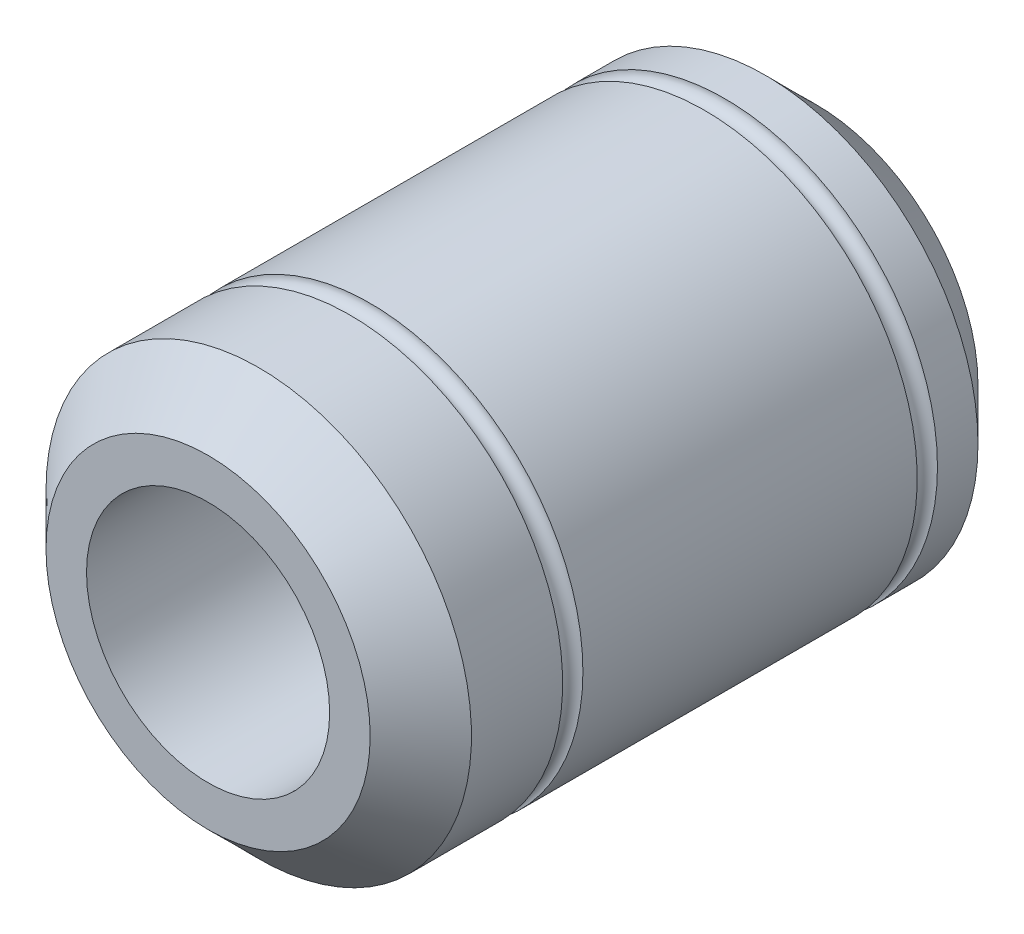
ISO-10303-21;
HEADER;
FILE_DESCRIPTION(('STEP AP214'),'2;1');
FILE_NAME('part.step','',(''),(''),'','','');
FILE_SCHEMA(('AUTOMOTIVE_DESIGN { 1 0 10303 214 1 1 1 1 }'));
ENDSEC;
DATA;
#1=APPLICATION_CONTEXT('core data for automotive mechanical design processes');
#2=APPLICATION_PROTOCOL_DEFINITION('international standard','automotive_design',2000,#1);
#3=PRODUCT_CONTEXT('',#1,'mechanical');
#4=PRODUCT('Part','Part','',(#3));
#5=PRODUCT_RELATED_PRODUCT_CATEGORY('part','',(#4));
#6=PRODUCT_DEFINITION_FORMATION('','',#4);
#7=PRODUCT_DEFINITION_CONTEXT('part definition',#1,'design');
#8=PRODUCT_DEFINITION('design','',#6,#7);
#9=PRODUCT_DEFINITION_SHAPE('','',#8);
#10=(LENGTH_UNIT() NAMED_UNIT(*) SI_UNIT(.MILLI.,.METRE.));
#11=(NAMED_UNIT(*) PLANE_ANGLE_UNIT() SI_UNIT($,.RADIAN.));
#12=(NAMED_UNIT(*) SI_UNIT($,.STERADIAN.) SOLID_ANGLE_UNIT());
#13=UNCERTAINTY_MEASURE_WITH_UNIT(LENGTH_MEASURE(1.E-05),#10,'distance_accuracy_value','');
#14=(GEOMETRIC_REPRESENTATION_CONTEXT(3) GLOBAL_UNCERTAINTY_ASSIGNED_CONTEXT((#13)) GLOBAL_UNIT_ASSIGNED_CONTEXT((#10,
#11,#12)) REPRESENTATION_CONTEXT('',''));
#15=CARTESIAN_POINT('',(0.,0.,0.));
#16=DIRECTION('',(0.,0.,1.));
#17=DIRECTION('',(1.,0.,0.));
#18=AXIS2_PLACEMENT_3D('',#15,#16,#17);
#19=CARTESIAN_POINT('',(0.,0.,-30.));
#20=DIRECTION('',(0.,0.,1.));
#21=DIRECTION('',(1.,0.,0.));
#22=AXIS2_PLACEMENT_3D('',#19,#20,#21);
#23=CYLINDRICAL_SURFACE('',#22,10.5);
#24=CARTESIAN_POINT('',(0.,0.,-27.5));
#25=DIRECTION('',(0.,0.,1.));
#26=DIRECTION('',(1.,0.,0.));
#27=AXIS2_PLACEMENT_3D('',#24,#25,#26);
#28=CIRCLE('',#27,10.5);
#29=CARTESIAN_POINT('',(10.5,0.,-27.5));
#30=VERTEX_POINT('',#29);
#31=EDGE_CURVE('E57',#30,#30,#28,.T.);
#32=ORIENTED_EDGE('',*,*,#31,.T.);
#33=EDGE_LOOP('',(#32));
#34=FACE_BOUND('',#33,.T.);
#35=CARTESIAN_POINT('',(0.,0.,-25.5));
#36=DIRECTION('',(0.,0.,1.));
#37=DIRECTION('',(1.,0.,0.));
#38=AXIS2_PLACEMENT_3D('',#35,#36,#37);
#39=CIRCLE('',#38,10.5);
#40=CARTESIAN_POINT('',(10.5,0.,-25.5));
#41=VERTEX_POINT('',#40);
#42=EDGE_CURVE('E48',#41,#41,#39,.F.);
#43=ORIENTED_EDGE('',*,*,#42,.T.);
#44=EDGE_LOOP('',(#43));
#45=FACE_BOUND('',#44,.T.);
#46=ADVANCED_FACE('F45',(#34,#45),#23,.T.);
#47=CARTESIAN_POINT('',(0.,0.,-2.5));
#48=DIRECTION('',(0.,0.,-1.));
#49=DIRECTION('',(-1.,0.,0.));
#50=AXIS2_PLACEMENT_3D('',#47,#48,#49);
#51=CIRCLE('',#50,10.5);
#52=CARTESIAN_POINT('',(-10.5,0.,-2.5));
#53=VERTEX_POINT('',#52);
#54=EDGE_CURVE('E65',#53,#53,#51,.T.);
#55=ORIENTED_EDGE('',*,*,#54,.T.);
#56=EDGE_LOOP('',(#55));
#57=FACE_BOUND('',#56,.T.);
#58=CARTESIAN_POINT('',(0.,0.,-7.));
#59=DIRECTION('',(0.,0.,-1.));
#60=DIRECTION('',(-1.,0.,0.));
#61=AXIS2_PLACEMENT_3D('',#58,#59,#60);
#62=CIRCLE('',#61,10.5);
#63=CARTESIAN_POINT('',(-10.5,0.,-7.));
#64=VERTEX_POINT('',#63);
#65=EDGE_CURVE('E69',#64,#64,#62,.F.);
#66=ORIENTED_EDGE('',*,*,#65,.T.);
#67=EDGE_LOOP('',(#66));
#68=FACE_BOUND('',#67,.T.);
#69=ADVANCED_FACE('F92',(#57,#68),#23,.T.);
#70=CARTESIAN_POINT('',(0.,0.,-30.));
#71=DIRECTION('',(0.,0.,1.));
#72=DIRECTION('',(1.,0.,0.));
#73=AXIS2_PLACEMENT_3D('',#70,#71,#72);
#74=PLANE('',#73);
#75=CARTESIAN_POINT('',(0.,0.,-30.));
#76=DIRECTION('',(0.,0.,1.));
#77=DIRECTION('',(1.,0.,0.));
#78=AXIS2_PLACEMENT_3D('',#75,#76,#77);
#79=CIRCLE('',#78,6.);
#80=CARTESIAN_POINT('',(6.,0.,-30.));
#81=VERTEX_POINT('',#80);
#82=EDGE_CURVE('E13',#81,#81,#79,.T.);
#83=ORIENTED_EDGE('',*,*,#82,.T.);
#84=EDGE_LOOP('',(#83));
#85=FACE_BOUND('',#84,.T.);
#86=CARTESIAN_POINT('',(0.,0.,-30.));
#87=DIRECTION('',(0.,0.,1.));
#88=DIRECTION('',(1.,0.,0.));
#89=AXIS2_PLACEMENT_3D('',#86,#87,#88);
#90=CIRCLE('',#89,7.99999999999996);
#91=CARTESIAN_POINT('',(7.99999999999996,0.,-30.));
#92=VERTEX_POINT('',#91);
#93=EDGE_CURVE('E66',#92,#92,#90,.T.);
#94=ORIENTED_EDGE('',*,*,#93,.F.);
#95=EDGE_LOOP('',(#94));
#96=FACE_BOUND('',#95,.T.);
#97=ADVANCED_FACE('F99',(#85,#96),#74,.F.);
#98=CARTESIAN_POINT('',(0.,0.,0.));
#99=DIRECTION('',(0.,0.,1.));
#100=DIRECTION('',(1.,0.,0.));
#101=AXIS2_PLACEMENT_3D('',#98,#99,#100);
#102=PLANE('',#101);
#103=CARTESIAN_POINT('',(0.,0.,0.));
#104=DIRECTION('',(0.,0.,1.));
#105=DIRECTION('',(1.,0.,0.));
#106=AXIS2_PLACEMENT_3D('',#103,#104,#105);
#107=CIRCLE('',#106,6.);
#108=CARTESIAN_POINT('',(6.,0.,0.));
#109=VERTEX_POINT('',#108);
#110=EDGE_CURVE('E52',#109,#109,#107,.T.);
#111=ORIENTED_EDGE('',*,*,#110,.F.);
#112=EDGE_LOOP('',(#111));
#113=FACE_BOUND('',#112,.T.);
#114=CARTESIAN_POINT('',(0.,0.,0.));
#115=DIRECTION('',(0.,0.,1.));
#116=DIRECTION('',(1.,0.,0.));
#117=AXIS2_PLACEMENT_3D('',#114,#115,#116);
#118=CIRCLE('',#117,7.99999999999997);
#119=CARTESIAN_POINT('',(7.99999999999997,0.,0.));
#120=VERTEX_POINT('',#119);
#121=EDGE_CURVE('E62',#120,#120,#118,.T.);
#122=ORIENTED_EDGE('',*,*,#121,.T.);
#123=EDGE_LOOP('',(#122));
#124=FACE_BOUND('',#123,.T.);
#125=ADVANCED_FACE('F112',(#113,#124),#102,.T.);
#126=CARTESIAN_POINT('',(0.,0.,-30.));
#127=DIRECTION('',(0.,0.,1.));
#128=DIRECTION('',(1.,0.,0.));
#129=AXIS2_PLACEMENT_3D('',#126,#127,#128);
#130=CYLINDRICAL_SURFACE('',#129,6.);
#131=ORIENTED_EDGE('',*,*,#82,.F.);
#132=EDGE_LOOP('',(#131));
#133=FACE_BOUND('',#132,.T.);
#134=ORIENTED_EDGE('',*,*,#110,.T.);
#135=EDGE_LOOP('',(#134));
#136=FACE_BOUND('',#135,.T.);
#137=ADVANCED_FACE('F117',(#133,#136),#130,.F.);
#138=CARTESIAN_POINT('',(0.,0.,-3.));
#139=DIRECTION('',(0.,0.,-1.));
#140=DIRECTION('',(-1.,0.,0.));
#141=AXIS2_PLACEMENT_3D('',#138,#139,#140);
#142=CONICAL_SURFACE('',#141,11.,0.785398163397453);
#143=ORIENTED_EDGE('',*,*,#54,.F.);
#144=EDGE_LOOP('',(#143));
#145=FACE_BOUND('',#144,.T.);
#146=ORIENTED_EDGE('',*,*,#121,.F.);
#147=EDGE_LOOP('',(#146));
#148=FACE_BOUND('',#147,.T.);
#149=ADVANCED_FACE('F107',(#145,#148),#142,.T.);
#150=CARTESIAN_POINT('',(0.,0.,-30.5));
#151=DIRECTION('',(0.,0.,1.));
#152=DIRECTION('',(1.,0.,0.));
#153=AXIS2_PLACEMENT_3D('',#150,#151,#152);
#154=CONICAL_SURFACE('',#153,7.49999999999995,0.785398163397454);
#155=ORIENTED_EDGE('',*,*,#31,.F.);
#156=EDGE_LOOP('',(#155));
#157=FACE_BOUND('',#156,.T.);
#158=ORIENTED_EDGE('',*,*,#93,.T.);
#159=EDGE_LOOP('',(#158));
#160=FACE_BOUND('',#159,.T.);
#161=ADVANCED_FACE('F104',(#157,#160),#154,.T.);
#162=CARTESIAN_POINT('',(0.,0.,-7.5));
#163=DIRECTION('',(0.,0.,-1.));
#164=DIRECTION('',(-1.,0.,0.));
#165=AXIS2_PLACEMENT_3D('',#162,#163,#164);
#166=TOROIDAL_SURFACE('',#165,10.5,0.500000000000001);
#167=CARTESIAN_POINT('',(0.,0.,-8.));
#168=DIRECTION('',(0.,0.,1.));
#169=DIRECTION('',(1.,0.,0.));
#170=AXIS2_PLACEMENT_3D('',#167,#168,#169);
#171=CIRCLE('',#170,10.5);
#172=CARTESIAN_POINT('',(10.5,0.,-8.));
#173=VERTEX_POINT('',#172);
#174=EDGE_CURVE('E72',#173,#173,#171,.F.);
#175=ORIENTED_EDGE('',*,*,#174,.F.);
#176=EDGE_LOOP('',(#175));
#177=FACE_BOUND('',#176,.T.);
#178=ORIENTED_EDGE('',*,*,#65,.F.);
#179=EDGE_LOOP('',(#178));
#180=FACE_BOUND('',#179,.T.);
#181=ADVANCED_FACE('F90',(#177,#180),#166,.F.);
#182=ORIENTED_EDGE('',*,*,#174,.T.);
#183=EDGE_LOOP('',(#182));
#184=FACE_BOUND('',#183,.T.);
#185=CARTESIAN_POINT('',(0.,0.,-24.5));
#186=DIRECTION('',(0.,0.,-1.));
#187=DIRECTION('',(-1.,0.,0.));
#188=AXIS2_PLACEMENT_3D('',#185,#186,#187);
#189=CIRCLE('',#188,10.5);
#190=CARTESIAN_POINT('',(-10.5,0.,-24.5));
#191=VERTEX_POINT('',#190);
#192=EDGE_CURVE('E74',#191,#191,#189,.F.);
#193=ORIENTED_EDGE('',*,*,#192,.T.);
#194=EDGE_LOOP('',(#193));
#195=FACE_BOUND('',#194,.T.);
#196=ADVANCED_FACE('F85',(#184,#195),#23,.T.);
#197=CARTESIAN_POINT('',(0.,0.,-25.));
#198=DIRECTION('',(0.,0.,-1.));
#199=DIRECTION('',(-1.,0.,0.));
#200=AXIS2_PLACEMENT_3D('',#197,#198,#199);
#201=TOROIDAL_SURFACE('',#200,10.5,0.500000000000001);
#202=ORIENTED_EDGE('',*,*,#42,.F.);
#203=EDGE_LOOP('',(#202));
#204=FACE_BOUND('',#203,.T.);
#205=ORIENTED_EDGE('',*,*,#192,.F.);
#206=EDGE_LOOP('',(#205));
#207=FACE_BOUND('',#206,.T.);
#208=ADVANCED_FACE('F82',(#204,#207),#201,.F.);
#209=CLOSED_SHELL('',(#46,#69,#97,#125,#137,#149,#161,#181,#196,#208));
#210=MANIFOLD_SOLID_BREP('B2',#209);
#211=ADVANCED_BREP_SHAPE_REPRESENTATION('',(#18,#210),#14);
#212=SHAPE_DEFINITION_REPRESENTATION(#9,#211);
ENDSEC;
END-ISO-10303-21;
